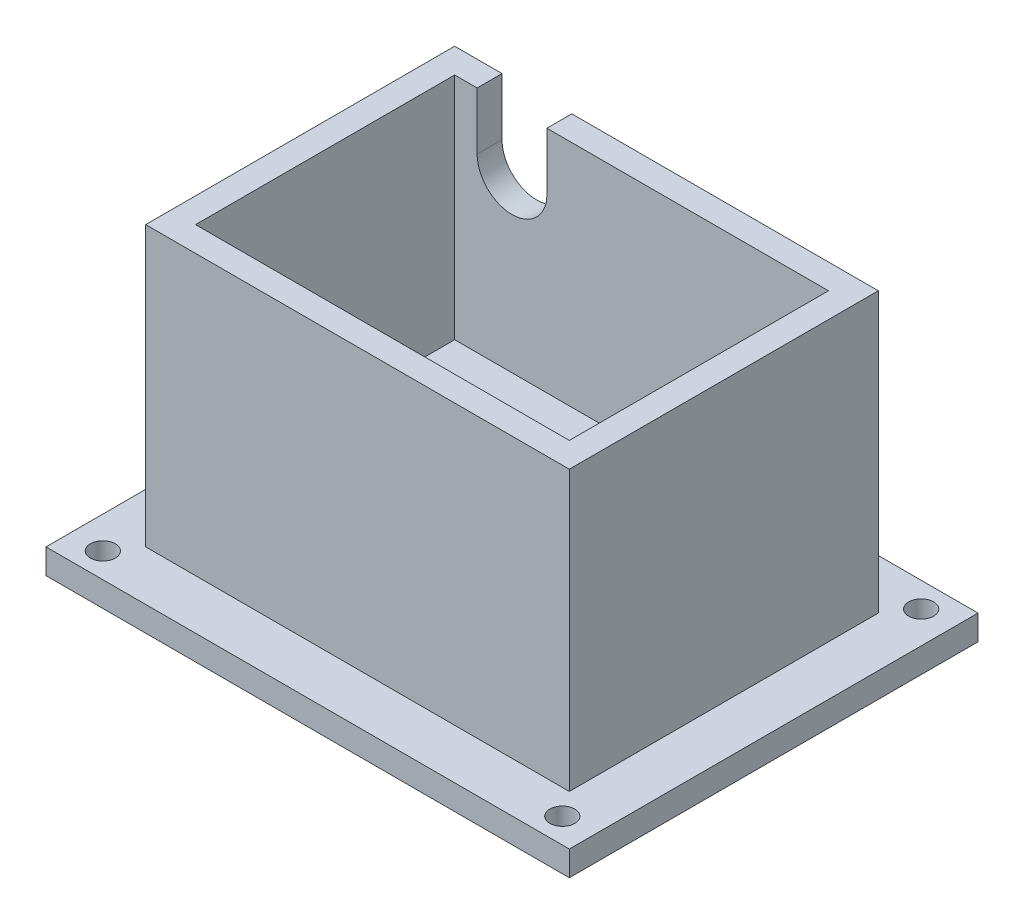
ISO-10303-21;
HEADER;
FILE_DESCRIPTION(('STEP AP214'),'2;1');
FILE_NAME('part.step','',(''),(''),'','','');
FILE_SCHEMA(('AUTOMOTIVE_DESIGN { 1 0 10303 214 1 1 1 1 }'));
ENDSEC;
DATA;
#1=APPLICATION_CONTEXT('core data for automotive mechanical design processes');
#2=APPLICATION_PROTOCOL_DEFINITION('international standard','automotive_design',2000,#1);
#3=PRODUCT_CONTEXT('',#1,'mechanical');
#4=PRODUCT('Part','Part','',(#3));
#5=PRODUCT_RELATED_PRODUCT_CATEGORY('part','',(#4));
#6=PRODUCT_DEFINITION_FORMATION('','',#4);
#7=PRODUCT_DEFINITION_CONTEXT('part definition',#1,'design');
#8=PRODUCT_DEFINITION('design','',#6,#7);
#9=PRODUCT_DEFINITION_SHAPE('','',#8);
#10=(LENGTH_UNIT() NAMED_UNIT(*) SI_UNIT(.MILLI.,.METRE.));
#11=(NAMED_UNIT(*) PLANE_ANGLE_UNIT() SI_UNIT($,.RADIAN.));
#12=(NAMED_UNIT(*) SI_UNIT($,.STERADIAN.) SOLID_ANGLE_UNIT());
#13=UNCERTAINTY_MEASURE_WITH_UNIT(LENGTH_MEASURE(1.E-05),#10,'distance_accuracy_value','');
#14=(GEOMETRIC_REPRESENTATION_CONTEXT(3) GLOBAL_UNCERTAINTY_ASSIGNED_CONTEXT((#13)) GLOBAL_UNIT_ASSIGNED_CONTEXT((#10,
#11,#12)) REPRESENTATION_CONTEXT('',''));
#15=CARTESIAN_POINT('',(0.,0.,0.));
#16=DIRECTION('',(0.,0.,1.));
#17=DIRECTION('',(1.,0.,0.));
#18=AXIS2_PLACEMENT_3D('',#15,#16,#17);
#19=CARTESIAN_POINT('',(160.,122.,10.));
#20=DIRECTION('',(-1.,0.,0.));
#21=DIRECTION('',(0.,0.,1.));
#22=AXIS2_PLACEMENT_3D('',#19,#20,#21);
#23=PLANE('',#22);
#24=DIRECTION('',(0.,0.,1.));
#25=VECTOR('',#24,1.);
#26=CARTESIAN_POINT('',(160.,9.99999999999999,10.));
#27=LINE('',#26,#25);
#28=CARTESIAN_POINT('',(160.,10.,-114.));
#29=VERTEX_POINT('',#28);
#30=CARTESIAN_POINT('',(160.,10.,10.));
#31=VERTEX_POINT('',#30);
#32=EDGE_CURVE('E55',#29,#31,#27,.T.);
#33=ORIENTED_EDGE('',*,*,#32,.F.);
#34=DIRECTION('',(0.,-1.,0.));
#35=VECTOR('',#34,1.);
#36=CARTESIAN_POINT('',(160.,122.,-114.));
#37=LINE('',#36,#35);
#38=CARTESIAN_POINT('',(160.,122.,-114.));
#39=VERTEX_POINT('',#38);
#40=EDGE_CURVE('E289',#39,#29,#37,.T.);
#41=ORIENTED_EDGE('',*,*,#40,.F.);
#42=DIRECTION('',(0.,0.,-1.));
#43=VECTOR('',#42,1.);
#44=CARTESIAN_POINT('',(160.,122.,10.));
#45=LINE('',#44,#43);
#46=CARTESIAN_POINT('',(160.,122.,10.));
#47=VERTEX_POINT('',#46);
#48=EDGE_CURVE('E265',#47,#39,#45,.T.);
#49=ORIENTED_EDGE('',*,*,#48,.F.);
#50=DIRECTION('',(0.,-1.,0.));
#51=VECTOR('',#50,1.);
#52=CARTESIAN_POINT('',(160.,122.,10.));
#53=LINE('',#52,#51);
#54=EDGE_CURVE('E280',#47,#31,#53,.T.);
#55=ORIENTED_EDGE('',*,*,#54,.T.);
#56=EDGE_LOOP('',(#33,#41,#49,#55));
#57=FACE_BOUND('',#56,.T.);
#58=ADVANCED_FACE('F39',(#57),#23,.F.);
#59=CARTESIAN_POINT('',(-10.,122.,-114.));
#60=DIRECTION('',(0.,0.,1.));
#61=DIRECTION('',(1.,0.,0.));
#62=AXIS2_PLACEMENT_3D('',#59,#60,#61);
#63=PLANE('',#62);
#64=DIRECTION('',(1.,0.,0.));
#65=VECTOR('',#64,1.);
#66=CARTESIAN_POINT('',(-10.,9.99999999999999,-114.));
#67=LINE('',#66,#65);
#68=CARTESIAN_POINT('',(-10.,10.,-114.));
#69=VERTEX_POINT('',#68);
#70=EDGE_CURVE('E62',#69,#29,#67,.T.);
#71=ORIENTED_EDGE('',*,*,#70,.F.);
#72=DIRECTION('',(0.,-1.,0.));
#73=VECTOR('',#72,1.);
#74=CARTESIAN_POINT('',(-10.,122.,-114.));
#75=LINE('',#74,#73);
#76=CARTESIAN_POINT('',(-10.,122.,-114.));
#77=VERTEX_POINT('',#76);
#78=EDGE_CURVE('E286',#77,#69,#75,.T.);
#79=ORIENTED_EDGE('',*,*,#78,.F.);
#80=DIRECTION('',(-1.,0.,0.));
#81=VECTOR('',#80,1.);
#82=CARTESIAN_POINT('',(-10.,122.,-114.));
#83=LINE('',#82,#81);
#84=CARTESIAN_POINT('',(9.,122.,-114.));
#85=VERTEX_POINT('',#84);
#86=EDGE_CURVE('E269',#85,#77,#83,.T.);
#87=ORIENTED_EDGE('',*,*,#86,.F.);
#88=DIRECTION('',(0.,1.,0.));
#89=VECTOR('',#88,1.);
#90=CARTESIAN_POINT('',(9.,99.,-114.));
#91=LINE('',#90,#89);
#92=CARTESIAN_POINT('',(8.99999999999999,99.,-114.));
#93=VERTEX_POINT('',#92);
#94=EDGE_CURVE('E200',#93,#85,#91,.T.);
#95=ORIENTED_EDGE('',*,*,#94,.F.);
#96=CARTESIAN_POINT('',(23.,99.,-114.));
#97=DIRECTION('',(0.,0.,-1.));
#98=DIRECTION('',(-1.,0.,0.));
#99=AXIS2_PLACEMENT_3D('',#96,#97,#98);
#100=CIRCLE('',#99,14.);
#101=CARTESIAN_POINT('',(37.,99.,-114.));
#102=VERTEX_POINT('',#101);
#103=EDGE_CURVE('E204',#102,#93,#100,.T.);
#104=ORIENTED_EDGE('',*,*,#103,.F.);
#105=DIRECTION('',(0.,-1.,0.));
#106=VECTOR('',#105,1.);
#107=CARTESIAN_POINT('',(37.,122.,-114.));
#108=LINE('',#107,#106);
#109=CARTESIAN_POINT('',(37.,122.,-114.));
#110=VERTEX_POINT('',#109);
#111=EDGE_CURVE('E199',#110,#102,#108,.T.);
#112=ORIENTED_EDGE('',*,*,#111,.F.);
#113=EDGE_CURVE('E270',#39,#110,#83,.T.);
#114=ORIENTED_EDGE('',*,*,#113,.F.);
#115=ORIENTED_EDGE('',*,*,#40,.T.);
#116=EDGE_LOOP('',(#71,#79,#87,#95,#104,#112,#114,#115));
#117=FACE_BOUND('',#116,.T.);
#118=ADVANCED_FACE('F337',(#117),#63,.F.);
#119=CARTESIAN_POINT('',(-10.,122.,10.));
#120=DIRECTION('',(1.,0.,0.));
#121=DIRECTION('',(0.,0.,-1.));
#122=AXIS2_PLACEMENT_3D('',#119,#120,#121);
#123=PLANE('',#122);
#124=DIRECTION('',(0.,0.,-1.));
#125=VECTOR('',#124,1.);
#126=CARTESIAN_POINT('',(-10.,9.99999999999999,10.));
#127=LINE('',#126,#125);
#128=CARTESIAN_POINT('',(-10.,9.99999999999999,10.));
#129=VERTEX_POINT('',#128);
#130=EDGE_CURVE('E185',#129,#69,#127,.T.);
#131=ORIENTED_EDGE('',*,*,#130,.F.);
#132=DIRECTION('',(0.,-1.,0.));
#133=VECTOR('',#132,1.);
#134=CARTESIAN_POINT('',(-10.,122.,10.));
#135=LINE('',#134,#133);
#136=CARTESIAN_POINT('',(-10.,122.,10.));
#137=VERTEX_POINT('',#136);
#138=EDGE_CURVE('E283',#137,#129,#135,.T.);
#139=ORIENTED_EDGE('',*,*,#138,.F.);
#140=DIRECTION('',(0.,0.,1.));
#141=VECTOR('',#140,1.);
#142=CARTESIAN_POINT('',(-10.,122.,10.));
#143=LINE('',#142,#141);
#144=EDGE_CURVE('E274',#77,#137,#143,.T.);
#145=ORIENTED_EDGE('',*,*,#144,.F.);
#146=ORIENTED_EDGE('',*,*,#78,.T.);
#147=EDGE_LOOP('',(#131,#139,#145,#146));
#148=FACE_BOUND('',#147,.T.);
#149=ADVANCED_FACE('F342',(#148),#123,.F.);
#150=CARTESIAN_POINT('',(-10.,122.,10.));
#151=DIRECTION('',(0.,0.,-1.));
#152=DIRECTION('',(-1.,0.,0.));
#153=AXIS2_PLACEMENT_3D('',#150,#151,#152);
#154=PLANE('',#153);
#155=DIRECTION('',(-1.,0.,0.));
#156=VECTOR('',#155,1.);
#157=CARTESIAN_POINT('',(-10.,9.99999999999999,10.));
#158=LINE('',#157,#156);
#159=EDGE_CURVE('E11',#31,#129,#158,.T.);
#160=ORIENTED_EDGE('',*,*,#159,.F.);
#161=ORIENTED_EDGE('',*,*,#54,.F.);
#162=DIRECTION('',(1.,0.,0.));
#163=VECTOR('',#162,1.);
#164=CARTESIAN_POINT('',(-10.,122.,10.));
#165=LINE('',#164,#163);
#166=EDGE_CURVE('E277',#137,#47,#165,.T.);
#167=ORIENTED_EDGE('',*,*,#166,.F.);
#168=ORIENTED_EDGE('',*,*,#138,.T.);
#169=EDGE_LOOP('',(#160,#161,#167,#168));
#170=FACE_BOUND('',#169,.T.);
#171=ADVANCED_FACE('F346',(#170),#154,.F.);
#172=CARTESIAN_POINT('',(0.,30.,0.));
#173=DIRECTION('',(0.,-1.,0.));
#174=DIRECTION('',(0.,0.,-1.));
#175=AXIS2_PLACEMENT_3D('',#172,#173,#174);
#176=PLANE('',#175);
#177=DIRECTION('',(0.,0.,1.));
#178=VECTOR('',#177,1.);
#179=CARTESIAN_POINT('',(0.,30.,0.));
#180=LINE('',#179,#178);
#181=CARTESIAN_POINT('',(0.,30.,-104.));
#182=VERTEX_POINT('',#181);
#183=CARTESIAN_POINT('',(0.,30.,0.));
#184=VERTEX_POINT('',#183);
#185=EDGE_CURVE('E292',#182,#184,#180,.T.);
#186=ORIENTED_EDGE('',*,*,#185,.T.);
#187=DIRECTION('',(1.,0.,0.));
#188=VECTOR('',#187,1.);
#189=CARTESIAN_POINT('',(0.,30.,0.));
#190=LINE('',#189,#188);
#191=CARTESIAN_POINT('',(150.,30.,0.));
#192=VERTEX_POINT('',#191);
#193=EDGE_CURVE('E296',#184,#192,#190,.T.);
#194=ORIENTED_EDGE('',*,*,#193,.T.);
#195=DIRECTION('',(0.,0.,-1.));
#196=VECTOR('',#195,1.);
#197=CARTESIAN_POINT('',(150.,30.,0.));
#198=LINE('',#197,#196);
#199=CARTESIAN_POINT('',(150.,30.,-104.));
#200=VERTEX_POINT('',#199);
#201=EDGE_CURVE('E300',#192,#200,#198,.T.);
#202=ORIENTED_EDGE('',*,*,#201,.T.);
#203=DIRECTION('',(-1.,0.,0.));
#204=VECTOR('',#203,1.);
#205=CARTESIAN_POINT('',(0.,30.,-104.));
#206=LINE('',#205,#204);
#207=EDGE_CURVE('E48',#200,#182,#206,.T.);
#208=ORIENTED_EDGE('',*,*,#207,.T.);
#209=EDGE_LOOP('',(#186,#194,#202,#208));
#210=FACE_BOUND('',#209,.T.);
#211=ADVANCED_FACE('F307',(#210),#176,.F.);
#212=CARTESIAN_POINT('',(150.,122.,-104.));
#213=DIRECTION('',(0.,0.,1.));
#214=DIRECTION('',(1.,0.,0.));
#215=AXIS2_PLACEMENT_3D('',#212,#213,#214);
#216=PLANE('',#215);
#217=DIRECTION('',(0.,-1.,0.));
#218=VECTOR('',#217,1.);
#219=CARTESIAN_POINT('',(37.,122.,-104.));
#220=LINE('',#219,#218);
#221=CARTESIAN_POINT('',(37.,122.,-104.));
#222=VERTEX_POINT('',#221);
#223=CARTESIAN_POINT('',(37.,99.,-104.));
#224=VERTEX_POINT('',#223);
#225=EDGE_CURVE('E203',#222,#224,#220,.T.);
#226=ORIENTED_EDGE('',*,*,#225,.T.);
#227=CARTESIAN_POINT('',(23.,99.,-104.));
#228=DIRECTION('',(0.,0.,1.));
#229=DIRECTION('',(1.,0.,0.));
#230=AXIS2_PLACEMENT_3D('',#227,#228,#229);
#231=CIRCLE('',#230,14.);
#232=CARTESIAN_POINT('',(9.,99.,-104.));
#233=VERTEX_POINT('',#232);
#234=EDGE_CURVE('E220',#224,#233,#231,.F.);
#235=ORIENTED_EDGE('',*,*,#234,.T.);
#236=DIRECTION('',(0.,1.,0.));
#237=VECTOR('',#236,1.);
#238=CARTESIAN_POINT('',(9.,99.,-104.));
#239=LINE('',#238,#237);
#240=CARTESIAN_POINT('',(9.,122.,-104.));
#241=VERTEX_POINT('',#240);
#242=EDGE_CURVE('E214',#233,#241,#239,.T.);
#243=ORIENTED_EDGE('',*,*,#242,.T.);
#244=DIRECTION('',(-1.,0.,0.));
#245=VECTOR('',#244,1.);
#246=CARTESIAN_POINT('',(150.,122.,-104.));
#247=LINE('',#246,#245);
#248=CARTESIAN_POINT('',(0.,122.,-104.));
#249=VERTEX_POINT('',#248);
#250=EDGE_CURVE('E235',#241,#249,#247,.T.);
#251=ORIENTED_EDGE('',*,*,#250,.T.);
#252=DIRECTION('',(0.,-1.,0.));
#253=VECTOR('',#252,1.);
#254=CARTESIAN_POINT('',(0.,122.,-104.));
#255=LINE('',#254,#253);
#256=EDGE_CURVE('E261',#249,#182,#255,.T.);
#257=ORIENTED_EDGE('',*,*,#256,.T.);
#258=ORIENTED_EDGE('',*,*,#207,.F.);
#259=DIRECTION('',(0.,-1.,0.));
#260=VECTOR('',#259,1.);
#261=CARTESIAN_POINT('',(150.,122.,-104.));
#262=LINE('',#261,#260);
#263=CARTESIAN_POINT('',(150.,122.,-104.));
#264=VERTEX_POINT('',#263);
#265=EDGE_CURVE('E250',#264,#200,#262,.T.);
#266=ORIENTED_EDGE('',*,*,#265,.F.);
#267=EDGE_CURVE('E236',#264,#222,#247,.T.);
#268=ORIENTED_EDGE('',*,*,#267,.T.);
#269=EDGE_LOOP('',(#226,#235,#243,#251,#257,#258,#266,#268));
#270=FACE_BOUND('',#269,.T.);
#271=ADVANCED_FACE('F310',(#270),#216,.T.);
#272=CARTESIAN_POINT('',(0.,122.,-104.));
#273=DIRECTION('',(1.,0.,0.));
#274=DIRECTION('',(0.,0.,-1.));
#275=AXIS2_PLACEMENT_3D('',#272,#273,#274);
#276=PLANE('',#275);
#277=ORIENTED_EDGE('',*,*,#185,.F.);
#278=ORIENTED_EDGE('',*,*,#256,.F.);
#279=DIRECTION('',(0.,0.,1.));
#280=VECTOR('',#279,1.);
#281=CARTESIAN_POINT('',(0.,122.,-104.));
#282=LINE('',#281,#280);
#283=CARTESIAN_POINT('',(0.,122.,0.));
#284=VERTEX_POINT('',#283);
#285=EDGE_CURVE('E240',#249,#284,#282,.T.);
#286=ORIENTED_EDGE('',*,*,#285,.T.);
#287=DIRECTION('',(0.,-1.,0.));
#288=VECTOR('',#287,1.);
#289=CARTESIAN_POINT('',(0.,122.,0.));
#290=LINE('',#289,#288);
#291=EDGE_CURVE('E257',#284,#184,#290,.T.);
#292=ORIENTED_EDGE('',*,*,#291,.T.);
#293=EDGE_LOOP('',(#277,#278,#286,#292));
#294=FACE_BOUND('',#293,.T.);
#295=ADVANCED_FACE('F316',(#294),#276,.T.);
#296=CARTESIAN_POINT('',(0.,122.,0.));
#297=DIRECTION('',(0.,0.,-1.));
#298=DIRECTION('',(-1.,0.,0.));
#299=AXIS2_PLACEMENT_3D('',#296,#297,#298);
#300=PLANE('',#299);
#301=ORIENTED_EDGE('',*,*,#193,.F.);
#302=ORIENTED_EDGE('',*,*,#291,.F.);
#303=DIRECTION('',(1.,0.,0.));
#304=VECTOR('',#303,1.);
#305=CARTESIAN_POINT('',(0.,122.,0.));
#306=LINE('',#305,#304);
#307=CARTESIAN_POINT('',(150.,122.,0.));
#308=VERTEX_POINT('',#307);
#309=EDGE_CURVE('E243',#284,#308,#306,.T.);
#310=ORIENTED_EDGE('',*,*,#309,.T.);
#311=DIRECTION('',(0.,-1.,0.));
#312=VECTOR('',#311,1.);
#313=CARTESIAN_POINT('',(150.,122.,0.));
#314=LINE('',#313,#312);
#315=EDGE_CURVE('E253',#308,#192,#314,.T.);
#316=ORIENTED_EDGE('',*,*,#315,.T.);
#317=EDGE_LOOP('',(#301,#302,#310,#316));
#318=FACE_BOUND('',#317,.T.);
#319=ADVANCED_FACE('F323',(#318),#300,.T.);
#320=CARTESIAN_POINT('',(150.,122.,0.));
#321=DIRECTION('',(-1.,0.,0.));
#322=DIRECTION('',(0.,0.,1.));
#323=AXIS2_PLACEMENT_3D('',#320,#321,#322);
#324=PLANE('',#323);
#325=ORIENTED_EDGE('',*,*,#201,.F.);
#326=ORIENTED_EDGE('',*,*,#315,.F.);
#327=DIRECTION('',(0.,0.,-1.));
#328=VECTOR('',#327,1.);
#329=CARTESIAN_POINT('',(150.,122.,0.));
#330=LINE('',#329,#328);
#331=EDGE_CURVE('E247',#308,#264,#330,.T.);
#332=ORIENTED_EDGE('',*,*,#331,.T.);
#333=ORIENTED_EDGE('',*,*,#265,.T.);
#334=EDGE_LOOP('',(#325,#326,#332,#333));
#335=FACE_BOUND('',#334,.T.);
#336=ADVANCED_FACE('F325',(#335),#324,.T.);
#337=CARTESIAN_POINT('',(0.,122.,0.));
#338=DIRECTION('',(0.,-1.,0.));
#339=DIRECTION('',(0.,0.,-1.));
#340=AXIS2_PLACEMENT_3D('',#337,#338,#339);
#341=PLANE('',#340);
#342=ORIENTED_EDGE('',*,*,#113,.T.);
#343=DIRECTION('',(0.,0.,-1.));
#344=VECTOR('',#343,1.);
#345=CARTESIAN_POINT('',(37.,122.,-57.5995689675193));
#346=LINE('',#345,#344);
#347=EDGE_CURVE('E227',#222,#110,#346,.T.);
#348=ORIENTED_EDGE('',*,*,#347,.F.);
#349=ORIENTED_EDGE('',*,*,#267,.F.);
#350=ORIENTED_EDGE('',*,*,#331,.F.);
#351=ORIENTED_EDGE('',*,*,#309,.F.);
#352=ORIENTED_EDGE('',*,*,#285,.F.);
#353=ORIENTED_EDGE('',*,*,#250,.F.);
#354=DIRECTION('',(0.,0.,-1.));
#355=VECTOR('',#354,1.);
#356=CARTESIAN_POINT('',(9.,122.,-57.5995689675193));
#357=LINE('',#356,#355);
#358=EDGE_CURVE('E218',#241,#85,#357,.T.);
#359=ORIENTED_EDGE('',*,*,#358,.T.);
#360=ORIENTED_EDGE('',*,*,#86,.T.);
#361=ORIENTED_EDGE('',*,*,#144,.T.);
#362=ORIENTED_EDGE('',*,*,#166,.T.);
#363=ORIENTED_EDGE('',*,*,#48,.T.);
#364=EDGE_LOOP('',(#342,#348,#349,#350,#351,#352,#353,#359,#360,#361,#362,#363));
#365=FACE_BOUND('',#364,.T.);
#366=ADVANCED_FACE('F320',(#365),#341,.F.);
#367=CARTESIAN_POINT('',(37.,122.,-57.5995689675193));
#368=DIRECTION('',(1.,0.,0.));
#369=DIRECTION('',(0.,0.,-1.));
#370=AXIS2_PLACEMENT_3D('',#367,#368,#369);
#371=PLANE('',#370);
#372=ORIENTED_EDGE('',*,*,#347,.T.);
#373=ORIENTED_EDGE('',*,*,#111,.T.);
#374=DIRECTION('',(0.,0.,-1.));
#375=VECTOR('',#374,1.);
#376=CARTESIAN_POINT('',(37.,99.,-57.5995689675193));
#377=LINE('',#376,#375);
#378=EDGE_CURVE('E213',#224,#102,#377,.T.);
#379=ORIENTED_EDGE('',*,*,#378,.F.);
#380=ORIENTED_EDGE('',*,*,#225,.F.);
#381=EDGE_LOOP('',(#372,#373,#379,#380));
#382=FACE_BOUND('',#381,.T.);
#383=ADVANCED_FACE('F332',(#382),#371,.F.);
#384=CARTESIAN_POINT('',(23.,99.,-57.5995689675193));
#385=DIRECTION('',(0.,0.,-1.));
#386=DIRECTION('',(-1.,0.,0.));
#387=AXIS2_PLACEMENT_3D('',#384,#385,#386);
#388=CYLINDRICAL_SURFACE('',#387,14.);
#389=ORIENTED_EDGE('',*,*,#378,.T.);
#390=ORIENTED_EDGE('',*,*,#103,.T.);
#391=DIRECTION('',(0.,0.,-1.));
#392=VECTOR('',#391,1.);
#393=CARTESIAN_POINT('',(9.,99.,-57.5995689675193));
#394=LINE('',#393,#392);
#395=EDGE_CURVE('E219',#233,#93,#394,.T.);
#396=ORIENTED_EDGE('',*,*,#395,.F.);
#397=ORIENTED_EDGE('',*,*,#234,.F.);
#398=EDGE_LOOP('',(#389,#390,#396,#397));
#399=FACE_BOUND('',#398,.T.);
#400=ADVANCED_FACE('F393',(#399),#388,.F.);
#401=CARTESIAN_POINT('',(9.,99.,-57.5995689675193));
#402=DIRECTION('',(-1.,0.,0.));
#403=DIRECTION('',(0.,-1.,0.));
#404=AXIS2_PLACEMENT_3D('',#401,#402,#403);
#405=PLANE('',#404);
#406=ORIENTED_EDGE('',*,*,#395,.T.);
#407=ORIENTED_EDGE('',*,*,#94,.T.);
#408=ORIENTED_EDGE('',*,*,#358,.F.);
#409=ORIENTED_EDGE('',*,*,#242,.F.);
#410=EDGE_LOOP('',(#406,#407,#408,#409));
#411=FACE_BOUND('',#410,.T.);
#412=ADVANCED_FACE('F402',(#411),#405,.F.);
#413=CARTESIAN_POINT('',(0.,10.,0.));
#414=DIRECTION('',(0.,-1.,0.));
#415=DIRECTION('',(0.,0.,-1.));
#416=AXIS2_PLACEMENT_3D('',#413,#414,#415);
#417=PLANE('',#416);
#418=DIRECTION('',(0.,0.,-1.));
#419=VECTOR('',#418,1.);
#420=CARTESIAN_POINT('',(180.,10.,30.));
#421=LINE('',#420,#419);
#422=CARTESIAN_POINT('',(180.,10.,30.));
#423=VERTEX_POINT('',#422);
#424=CARTESIAN_POINT('',(180.,10.,-134.));
#425=VERTEX_POINT('',#424);
#426=EDGE_CURVE('E168',#423,#425,#421,.T.);
#427=ORIENTED_EDGE('',*,*,#426,.T.);
#428=DIRECTION('',(-1.,0.,0.));
#429=VECTOR('',#428,1.);
#430=CARTESIAN_POINT('',(-30.,10.,-134.));
#431=LINE('',#430,#429);
#432=CARTESIAN_POINT('',(-30.,10.,-134.));
#433=VERTEX_POINT('',#432);
#434=EDGE_CURVE('E156',#425,#433,#431,.T.);
#435=ORIENTED_EDGE('',*,*,#434,.T.);
#436=DIRECTION('',(0.,0.,1.));
#437=VECTOR('',#436,1.);
#438=CARTESIAN_POINT('',(-30.,10.,30.));
#439=LINE('',#438,#437);
#440=CARTESIAN_POINT('',(-30.,10.,30.));
#441=VERTEX_POINT('',#440);
#442=EDGE_CURVE('E167',#433,#441,#439,.T.);
#443=ORIENTED_EDGE('',*,*,#442,.T.);
#444=DIRECTION('',(1.,0.,0.));
#445=VECTOR('',#444,1.);
#446=CARTESIAN_POINT('',(-30.,10.,30.));
#447=LINE('',#446,#445);
#448=EDGE_CURVE('E174',#441,#423,#447,.T.);
#449=ORIENTED_EDGE('',*,*,#448,.T.);
#450=EDGE_LOOP('',(#427,#435,#443,#449));
#451=FACE_BOUND('',#450,.T.);
#452=CARTESIAN_POINT('',(-17.1951219512196,10.,20.));
#453=DIRECTION('',(0.,1.,0.));
#454=DIRECTION('',(0.,0.,1.));
#455=AXIS2_PLACEMENT_3D('',#452,#453,#454);
#456=CIRCLE('',#455,5.);
#457=CARTESIAN_POINT('',(-17.1951219512196,10.,25.));
#458=VERTEX_POINT('',#457);
#459=EDGE_CURVE('E572',#458,#458,#456,.T.);
#460=ORIENTED_EDGE('',*,*,#459,.F.);
#461=EDGE_LOOP('',(#460));
#462=FACE_BOUND('',#461,.T.);
#463=CARTESIAN_POINT('',(167.19512195122,10.,20.));
#464=DIRECTION('',(0.,1.,0.));
#465=DIRECTION('',(0.,0.,1.));
#466=AXIS2_PLACEMENT_3D('',#463,#464,#465);
#467=CIRCLE('',#466,4.99999999999999);
#468=CARTESIAN_POINT('',(167.19512195122,10.,25.));
#469=VERTEX_POINT('',#468);
#470=EDGE_CURVE('E566',#469,#469,#467,.T.);
#471=ORIENTED_EDGE('',*,*,#470,.F.);
#472=EDGE_LOOP('',(#471));
#473=FACE_BOUND('',#472,.T.);
#474=CARTESIAN_POINT('',(167.19512195122,10.,-124.));
#475=DIRECTION('',(0.,1.,0.));
#476=DIRECTION('',(0.,0.,1.));
#477=AXIS2_PLACEMENT_3D('',#474,#475,#476);
#478=CIRCLE('',#477,5.00000000000001);
#479=CARTESIAN_POINT('',(167.19512195122,10.,-119.));
#480=VERTEX_POINT('',#479);
#481=EDGE_CURVE('E555',#480,#480,#478,.T.);
#482=ORIENTED_EDGE('',*,*,#481,.F.);
#483=EDGE_LOOP('',(#482));
#484=FACE_BOUND('',#483,.T.);
#485=CARTESIAN_POINT('',(-17.1951219512196,10.,-124.));
#486=DIRECTION('',(0.,1.,0.));
#487=DIRECTION('',(0.,0.,1.));
#488=AXIS2_PLACEMENT_3D('',#485,#486,#487);
#489=CIRCLE('',#488,5.);
#490=CARTESIAN_POINT('',(-17.1951219512196,10.,-119.));
#491=VERTEX_POINT('',#490);
#492=EDGE_CURVE('E556',#491,#491,#489,.T.);
#493=ORIENTED_EDGE('',*,*,#492,.F.);
#494=EDGE_LOOP('',(#493));
#495=FACE_BOUND('',#494,.T.);
#496=ORIENTED_EDGE('',*,*,#70,.T.);
#497=ORIENTED_EDGE('',*,*,#32,.T.);
#498=ORIENTED_EDGE('',*,*,#159,.T.);
#499=ORIENTED_EDGE('',*,*,#130,.T.);
#500=EDGE_LOOP('',(#496,#497,#498,#499));
#501=FACE_BOUND('',#500,.T.);
#502=ADVANCED_FACE('F171',(#451,#462,#473,#484,#495,#501),#417,.F.);
#503=CARTESIAN_POINT('',(180.,10.,30.));
#504=DIRECTION('',(-1.,0.,0.));
#505=DIRECTION('',(0.,0.,1.));
#506=AXIS2_PLACEMENT_3D('',#503,#504,#505);
#507=PLANE('',#506);
#508=DIRECTION('',(0.,0.,-1.));
#509=VECTOR('',#508,1.);
#510=CARTESIAN_POINT('',(180.,0.,30.));
#511=LINE('',#510,#509);
#512=CARTESIAN_POINT('',(180.,0.,30.));
#513=VERTEX_POINT('',#512);
#514=CARTESIAN_POINT('',(180.,0.,-134.));
#515=VERTEX_POINT('',#514);
#516=EDGE_CURVE('E183',#513,#515,#511,.T.);
#517=ORIENTED_EDGE('',*,*,#516,.T.);
#518=DIRECTION('',(0.,-1.,0.));
#519=VECTOR('',#518,1.);
#520=CARTESIAN_POINT('',(180.,10.,-134.));
#521=LINE('',#520,#519);
#522=EDGE_CURVE('E160',#425,#515,#521,.T.);
#523=ORIENTED_EDGE('',*,*,#522,.F.);
#524=ORIENTED_EDGE('',*,*,#426,.F.);
#525=DIRECTION('',(0.,-1.,0.));
#526=VECTOR('',#525,1.);
#527=CARTESIAN_POINT('',(180.,10.,30.));
#528=LINE('',#527,#526);
#529=EDGE_CURVE('E582',#423,#513,#528,.T.);
#530=ORIENTED_EDGE('',*,*,#529,.T.);
#531=EDGE_LOOP('',(#517,#523,#524,#530));
#532=FACE_BOUND('',#531,.T.);
#533=ADVANCED_FACE('F181',(#532),#507,.F.);
#534=CARTESIAN_POINT('',(-30.,10.,-134.));
#535=DIRECTION('',(0.,0.,1.));
#536=DIRECTION('',(1.,0.,0.));
#537=AXIS2_PLACEMENT_3D('',#534,#535,#536);
#538=PLANE('',#537);
#539=DIRECTION('',(-1.,0.,0.));
#540=VECTOR('',#539,1.);
#541=CARTESIAN_POINT('',(-30.,0.,-134.));
#542=LINE('',#541,#540);
#543=CARTESIAN_POINT('',(-30.,0.,-134.));
#544=VERTEX_POINT('',#543);
#545=EDGE_CURVE('E585',#515,#544,#542,.T.);
#546=ORIENTED_EDGE('',*,*,#545,.T.);
#547=DIRECTION('',(0.,-1.,0.));
#548=VECTOR('',#547,1.);
#549=CARTESIAN_POINT('',(-30.,10.,-134.));
#550=LINE('',#549,#548);
#551=EDGE_CURVE('E163',#433,#544,#550,.T.);
#552=ORIENTED_EDGE('',*,*,#551,.F.);
#553=ORIENTED_EDGE('',*,*,#434,.F.);
#554=ORIENTED_EDGE('',*,*,#522,.T.);
#555=EDGE_LOOP('',(#546,#552,#553,#554));
#556=FACE_BOUND('',#555,.T.);
#557=ADVANCED_FACE('F158',(#556),#538,.F.);
#558=CARTESIAN_POINT('',(-30.,10.,30.));
#559=DIRECTION('',(1.,0.,0.));
#560=DIRECTION('',(0.,0.,-1.));
#561=AXIS2_PLACEMENT_3D('',#558,#559,#560);
#562=PLANE('',#561);
#563=DIRECTION('',(0.,0.,1.));
#564=VECTOR('',#563,1.);
#565=CARTESIAN_POINT('',(-30.,0.,30.));
#566=LINE('',#565,#564);
#567=CARTESIAN_POINT('',(-30.,0.,30.));
#568=VERTEX_POINT('',#567);
#569=EDGE_CURVE('E588',#544,#568,#566,.T.);
#570=ORIENTED_EDGE('',*,*,#569,.T.);
#571=DIRECTION('',(0.,-1.,0.));
#572=VECTOR('',#571,1.);
#573=CARTESIAN_POINT('',(-30.,10.,30.));
#574=LINE('',#573,#572);
#575=EDGE_CURVE('E191',#441,#568,#574,.T.);
#576=ORIENTED_EDGE('',*,*,#575,.F.);
#577=ORIENTED_EDGE('',*,*,#442,.F.);
#578=ORIENTED_EDGE('',*,*,#551,.T.);
#579=EDGE_LOOP('',(#570,#576,#577,#578));
#580=FACE_BOUND('',#579,.T.);
#581=ADVANCED_FACE('F457',(#580),#562,.F.);
#582=CARTESIAN_POINT('',(-30.,10.,30.));
#583=DIRECTION('',(0.,0.,-1.));
#584=DIRECTION('',(-1.,0.,0.));
#585=AXIS2_PLACEMENT_3D('',#582,#583,#584);
#586=PLANE('',#585);
#587=DIRECTION('',(1.,0.,0.));
#588=VECTOR('',#587,1.);
#589=CARTESIAN_POINT('',(-30.,0.,30.));
#590=LINE('',#589,#588);
#591=EDGE_CURVE('E179',#568,#513,#590,.T.);
#592=ORIENTED_EDGE('',*,*,#591,.T.);
#593=ORIENTED_EDGE('',*,*,#529,.F.);
#594=ORIENTED_EDGE('',*,*,#448,.F.);
#595=ORIENTED_EDGE('',*,*,#575,.T.);
#596=EDGE_LOOP('',(#592,#593,#594,#595));
#597=FACE_BOUND('',#596,.T.);
#598=ADVANCED_FACE('F466',(#597),#586,.F.);
#599=CARTESIAN_POINT('',(-17.1951219512196,10.,20.));
#600=DIRECTION('',(0.,-1.,0.));
#601=DIRECTION('',(0.,0.,-1.));
#602=AXIS2_PLACEMENT_3D('',#599,#600,#601);
#603=CYLINDRICAL_SURFACE('',#602,5.);
#604=ORIENTED_EDGE('',*,*,#459,.T.);
#605=EDGE_LOOP('',(#604));
#606=FACE_BOUND('',#605,.T.);
#607=CARTESIAN_POINT('',(-17.1951219512196,0.,20.));
#608=DIRECTION('',(0.,1.,0.));
#609=DIRECTION('',(0.,0.,1.));
#610=AXIS2_PLACEMENT_3D('',#607,#608,#609);
#611=CIRCLE('',#610,5.);
#612=CARTESIAN_POINT('',(-17.1951219512196,0.,25.));
#613=VERTEX_POINT('',#612);
#614=EDGE_CURVE('E549',#613,#613,#611,.T.);
#615=ORIENTED_EDGE('',*,*,#614,.F.);
#616=EDGE_LOOP('',(#615));
#617=FACE_BOUND('',#616,.T.);
#618=ADVANCED_FACE('F476',(#606,#617),#603,.F.);
#619=CARTESIAN_POINT('',(167.19512195122,10.,20.));
#620=DIRECTION('',(0.,-1.,0.));
#621=DIRECTION('',(0.,0.,-1.));
#622=AXIS2_PLACEMENT_3D('',#619,#620,#621);
#623=CYLINDRICAL_SURFACE('',#622,4.99999999999999);
#624=ORIENTED_EDGE('',*,*,#470,.T.);
#625=EDGE_LOOP('',(#624));
#626=FACE_BOUND('',#625,.T.);
#627=CARTESIAN_POINT('',(167.19512195122,0.,20.));
#628=DIRECTION('',(0.,1.,0.));
#629=DIRECTION('',(0.,0.,1.));
#630=AXIS2_PLACEMENT_3D('',#627,#628,#629);
#631=CIRCLE('',#630,4.99999999999999);
#632=CARTESIAN_POINT('',(167.19512195122,0.,25.));
#633=VERTEX_POINT('',#632);
#634=EDGE_CURVE('E543',#633,#633,#631,.T.);
#635=ORIENTED_EDGE('',*,*,#634,.F.);
#636=EDGE_LOOP('',(#635));
#637=FACE_BOUND('',#636,.T.);
#638=ADVANCED_FACE('F486',(#626,#637),#623,.F.);
#639=CARTESIAN_POINT('',(167.19512195122,10.,-124.));
#640=DIRECTION('',(0.,-1.,0.));
#641=DIRECTION('',(0.,0.,-1.));
#642=AXIS2_PLACEMENT_3D('',#639,#640,#641);
#643=CYLINDRICAL_SURFACE('',#642,5.00000000000001);
#644=ORIENTED_EDGE('',*,*,#481,.T.);
#645=EDGE_LOOP('',(#644));
#646=FACE_BOUND('',#645,.T.);
#647=CARTESIAN_POINT('',(167.19512195122,0.,-124.));
#648=DIRECTION('',(0.,1.,0.));
#649=DIRECTION('',(0.,0.,1.));
#650=AXIS2_PLACEMENT_3D('',#647,#648,#649);
#651=CIRCLE('',#650,5.00000000000001);
#652=CARTESIAN_POINT('',(167.19512195122,0.,-119.));
#653=VERTEX_POINT('',#652);
#654=EDGE_CURVE('E552',#653,#653,#651,.T.);
#655=ORIENTED_EDGE('',*,*,#654,.F.);
#656=EDGE_LOOP('',(#655));
#657=FACE_BOUND('',#656,.T.);
#658=ADVANCED_FACE('F496',(#646,#657),#643,.F.);
#659=CARTESIAN_POINT('',(-17.1951219512196,10.,-124.));
#660=DIRECTION('',(0.,-1.,0.));
#661=DIRECTION('',(0.,0.,-1.));
#662=AXIS2_PLACEMENT_3D('',#659,#660,#661);
#663=CYLINDRICAL_SURFACE('',#662,5.);
#664=ORIENTED_EDGE('',*,*,#492,.T.);
#665=EDGE_LOOP('',(#664));
#666=FACE_BOUND('',#665,.T.);
#667=CARTESIAN_POINT('',(-17.1951219512196,0.,-124.));
#668=DIRECTION('',(0.,1.,0.));
#669=DIRECTION('',(0.,0.,1.));
#670=AXIS2_PLACEMENT_3D('',#667,#668,#669);
#671=CIRCLE('',#670,5.);
#672=CARTESIAN_POINT('',(-17.1951219512196,0.,-119.));
#673=VERTEX_POINT('',#672);
#674=EDGE_CURVE('E539',#673,#673,#671,.T.);
#675=ORIENTED_EDGE('',*,*,#674,.F.);
#676=EDGE_LOOP('',(#675));
#677=FACE_BOUND('',#676,.T.);
#678=ADVANCED_FACE('F506',(#666,#677),#663,.F.);
#679=CARTESIAN_POINT('',(0.,0.,0.));
#680=DIRECTION('',(0.,-1.,0.));
#681=DIRECTION('',(0.,0.,-1.));
#682=AXIS2_PLACEMENT_3D('',#679,#680,#681);
#683=PLANE('',#682);
#684=ORIENTED_EDGE('',*,*,#674,.T.);
#685=EDGE_LOOP('',(#684));
#686=FACE_BOUND('',#685,.T.);
#687=ORIENTED_EDGE('',*,*,#634,.T.);
#688=EDGE_LOOP('',(#687));
#689=FACE_BOUND('',#688,.T.);
#690=ORIENTED_EDGE('',*,*,#516,.F.);
#691=ORIENTED_EDGE('',*,*,#591,.F.);
#692=ORIENTED_EDGE('',*,*,#569,.F.);
#693=ORIENTED_EDGE('',*,*,#545,.F.);
#694=EDGE_LOOP('',(#690,#691,#692,#693));
#695=FACE_BOUND('',#694,.T.);
#696=ORIENTED_EDGE('',*,*,#614,.T.);
#697=EDGE_LOOP('',(#696));
#698=FACE_BOUND('',#697,.T.);
#699=ORIENTED_EDGE('',*,*,#654,.T.);
#700=EDGE_LOOP('',(#699));
#701=FACE_BOUND('',#700,.T.);
#702=ADVANCED_FACE('F41',(#686,#689,#695,#698,#701),#683,.T.);
#703=CLOSED_SHELL('',(#58,#118,#149,#171,#211,#271,#295,#319,#336,#366,#383,#400,#412,#502,#533,
#557,#581,#598,#618,#638,#658,#678,#702));
#704=MANIFOLD_SOLID_BREP('B2',#703);
#705=ADVANCED_BREP_SHAPE_REPRESENTATION('',(#18,#704),#14);
#706=SHAPE_DEFINITION_REPRESENTATION(#9,#705);
ENDSEC;
END-ISO-10303-21;
